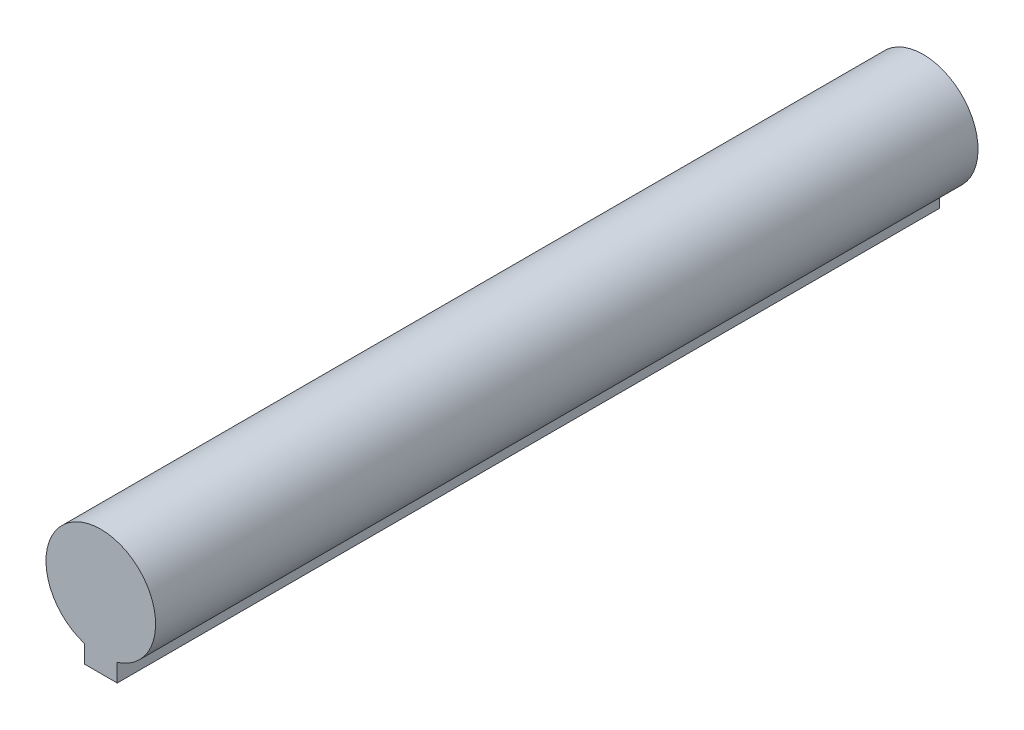
ISO-10303-21;
HEADER;
FILE_DESCRIPTION(('STEP AP214'),'2;1');
FILE_NAME('part.step','',(''),(''),'','','');
FILE_SCHEMA(('AUTOMOTIVE_DESIGN { 1 0 10303 214 1 1 1 1 }'));
ENDSEC;
DATA;
#1=APPLICATION_CONTEXT('core data for automotive mechanical design processes');
#2=APPLICATION_PROTOCOL_DEFINITION('international standard','automotive_design',2000,#1);
#3=PRODUCT_CONTEXT('',#1,'mechanical');
#4=PRODUCT('Part','Part','',(#3));
#5=PRODUCT_RELATED_PRODUCT_CATEGORY('part','',(#4));
#6=PRODUCT_DEFINITION_FORMATION('','',#4);
#7=PRODUCT_DEFINITION_CONTEXT('part definition',#1,'design');
#8=PRODUCT_DEFINITION('design','',#6,#7);
#9=PRODUCT_DEFINITION_SHAPE('','',#8);
#10=(LENGTH_UNIT() NAMED_UNIT(*) SI_UNIT(.MILLI.,.METRE.));
#11=(NAMED_UNIT(*) PLANE_ANGLE_UNIT() SI_UNIT($,.RADIAN.));
#12=(NAMED_UNIT(*) SI_UNIT($,.STERADIAN.) SOLID_ANGLE_UNIT());
#13=UNCERTAINTY_MEASURE_WITH_UNIT(LENGTH_MEASURE(1.E-05),#10,'distance_accuracy_value','');
#14=(GEOMETRIC_REPRESENTATION_CONTEXT(3) GLOBAL_UNCERTAINTY_ASSIGNED_CONTEXT((#13)) GLOBAL_UNIT_ASSIGNED_CONTEXT((#10,
#11,#12)) REPRESENTATION_CONTEXT('',''));
#15=CARTESIAN_POINT('',(0.,0.,0.));
#16=DIRECTION('',(0.,0.,1.));
#17=DIRECTION('',(1.,0.,0.));
#18=AXIS2_PLACEMENT_3D('',#15,#16,#17);
#19=CARTESIAN_POINT('',(-3.,-12.7993920141695,150.));
#20=DIRECTION('',(1.,0.,0.));
#21=DIRECTION('',(0.,0.,-1.));
#22=AXIS2_PLACEMENT_3D('',#19,#20,#21);
#23=PLANE('',#22);
#24=DIRECTION('',(0.,-1.,0.));
#25=VECTOR('',#24,1.);
#26=CARTESIAN_POINT('',(-3.,-12.7993920141695,0.));
#27=LINE('',#26,#25);
#28=CARTESIAN_POINT('',(-3.,-9.53939201416946,0.));
#29=VERTEX_POINT('',#28);
#30=CARTESIAN_POINT('',(-3.,-12.7993920141695,0.));
#31=VERTEX_POINT('',#30);
#32=EDGE_CURVE('E109',#29,#31,#27,.T.);
#33=ORIENTED_EDGE('',*,*,#32,.T.);
#34=DIRECTION('',(0.,0.,-1.));
#35=VECTOR('',#34,1.);
#36=CARTESIAN_POINT('',(-3.,-12.7993920141695,150.));
#37=LINE('',#36,#35);
#38=CARTESIAN_POINT('',(-3.,-12.7993920141695,150.));
#39=VERTEX_POINT('',#38);
#40=EDGE_CURVE('E11',#39,#31,#37,.T.);
#41=ORIENTED_EDGE('',*,*,#40,.F.);
#42=DIRECTION('',(0.,-1.,0.));
#43=VECTOR('',#42,1.);
#44=CARTESIAN_POINT('',(-3.,-12.7993920141695,150.));
#45=LINE('',#44,#43);
#46=CARTESIAN_POINT('',(-3.,-9.53939201416946,150.));
#47=VERTEX_POINT('',#46);
#48=EDGE_CURVE('E93',#47,#39,#45,.T.);
#49=ORIENTED_EDGE('',*,*,#48,.F.);
#50=DIRECTION('',(0.,0.,-1.));
#51=VECTOR('',#50,1.);
#52=CARTESIAN_POINT('',(-3.,-9.53939201416946,150.));
#53=LINE('',#52,#51);
#54=EDGE_CURVE('E105',#47,#29,#53,.T.);
#55=ORIENTED_EDGE('',*,*,#54,.T.);
#56=EDGE_LOOP('',(#33,#41,#49,#55));
#57=FACE_BOUND('',#56,.T.);
#58=ADVANCED_FACE('F41',(#57),#23,.F.);
#59=CARTESIAN_POINT('',(-3.,-12.7993920141695,150.));
#60=DIRECTION('',(0.,1.,0.));
#61=DIRECTION('',(0.,0.,1.));
#62=AXIS2_PLACEMENT_3D('',#59,#60,#61);
#63=PLANE('',#62);
#64=DIRECTION('',(1.,0.,0.));
#65=VECTOR('',#64,1.);
#66=CARTESIAN_POINT('',(-3.,-12.7993920141695,0.));
#67=LINE('',#66,#65);
#68=CARTESIAN_POINT('',(3.,-12.7993920141695,0.));
#69=VERTEX_POINT('',#68);
#70=EDGE_CURVE('E98',#31,#69,#67,.T.);
#71=ORIENTED_EDGE('',*,*,#70,.T.);
#72=DIRECTION('',(0.,0.,-1.));
#73=VECTOR('',#72,1.);
#74=CARTESIAN_POINT('',(3.,-12.7993920141695,150.));
#75=LINE('',#74,#73);
#76=CARTESIAN_POINT('',(3.,-12.7993920141695,150.));
#77=VERTEX_POINT('',#76);
#78=EDGE_CURVE('E50',#77,#69,#75,.T.);
#79=ORIENTED_EDGE('',*,*,#78,.F.);
#80=DIRECTION('',(1.,0.,0.));
#81=VECTOR('',#80,1.);
#82=CARTESIAN_POINT('',(-3.,-12.7993920141695,150.));
#83=LINE('',#82,#81);
#84=EDGE_CURVE('E88',#39,#77,#83,.T.);
#85=ORIENTED_EDGE('',*,*,#84,.F.);
#86=ORIENTED_EDGE('',*,*,#40,.T.);
#87=EDGE_LOOP('',(#71,#79,#85,#86));
#88=FACE_BOUND('',#87,.T.);
#89=ADVANCED_FACE('F97',(#88),#63,.F.);
#90=CARTESIAN_POINT('',(3.,-12.7993920141695,150.));
#91=DIRECTION('',(-1.,0.,0.));
#92=DIRECTION('',(0.,0.,1.));
#93=AXIS2_PLACEMENT_3D('',#90,#91,#92);
#94=PLANE('',#93);
#95=DIRECTION('',(0.,1.,0.));
#96=VECTOR('',#95,1.);
#97=CARTESIAN_POINT('',(3.,-12.7993920141695,0.));
#98=LINE('',#97,#96);
#99=CARTESIAN_POINT('',(3.,-9.53939201416946,0.));
#100=VERTEX_POINT('',#99);
#101=EDGE_CURVE('E75',#69,#100,#98,.T.);
#102=ORIENTED_EDGE('',*,*,#101,.T.);
#103=DIRECTION('',(0.,0.,-1.));
#104=VECTOR('',#103,1.);
#105=CARTESIAN_POINT('',(3.,-9.53939201416946,150.));
#106=LINE('',#105,#104);
#107=CARTESIAN_POINT('',(3.,-9.53939201416946,150.));
#108=VERTEX_POINT('',#107);
#109=EDGE_CURVE('E100',#108,#100,#106,.T.);
#110=ORIENTED_EDGE('',*,*,#109,.F.);
#111=DIRECTION('',(0.,1.,0.));
#112=VECTOR('',#111,1.);
#113=CARTESIAN_POINT('',(3.,-12.7993920141695,150.));
#114=LINE('',#113,#112);
#115=EDGE_CURVE('E91',#77,#108,#114,.T.);
#116=ORIENTED_EDGE('',*,*,#115,.F.);
#117=ORIENTED_EDGE('',*,*,#78,.T.);
#118=EDGE_LOOP('',(#102,#110,#116,#117));
#119=FACE_BOUND('',#118,.T.);
#120=ADVANCED_FACE('F101',(#119),#94,.F.);
#121=CARTESIAN_POINT('',(0.,0.,150.));
#122=DIRECTION('',(0.,0.,-1.));
#123=DIRECTION('',(-1.,0.,0.));
#124=AXIS2_PLACEMENT_3D('',#121,#122,#123);
#125=CYLINDRICAL_SURFACE('',#124,10.);
#126=CARTESIAN_POINT('',(0.,0.,0.));
#127=DIRECTION('',(0.,0.,1.));
#128=DIRECTION('',(1.,0.,0.));
#129=AXIS2_PLACEMENT_3D('',#126,#127,#128);
#130=CIRCLE('',#129,10.);
#131=EDGE_CURVE('E81',#100,#29,#130,.T.);
#132=ORIENTED_EDGE('',*,*,#131,.T.);
#133=ORIENTED_EDGE('',*,*,#54,.F.);
#134=CARTESIAN_POINT('',(0.,0.,150.));
#135=DIRECTION('',(0.,0.,1.));
#136=DIRECTION('',(1.,0.,0.));
#137=AXIS2_PLACEMENT_3D('',#134,#135,#136);
#138=CIRCLE('',#137,10.);
#139=EDGE_CURVE('E58',#108,#47,#138,.T.);
#140=ORIENTED_EDGE('',*,*,#139,.F.);
#141=ORIENTED_EDGE('',*,*,#109,.T.);
#142=EDGE_LOOP('',(#132,#133,#140,#141));
#143=FACE_BOUND('',#142,.T.);
#144=ADVANCED_FACE('F122',(#143),#125,.T.);
#145=CARTESIAN_POINT('',(0.,0.,150.));
#146=DIRECTION('',(0.,0.,1.));
#147=DIRECTION('',(1.,0.,0.));
#148=AXIS2_PLACEMENT_3D('',#145,#146,#147);
#149=PLANE('',#148);
#150=ORIENTED_EDGE('',*,*,#48,.T.);
#151=ORIENTED_EDGE('',*,*,#84,.T.);
#152=ORIENTED_EDGE('',*,*,#115,.T.);
#153=ORIENTED_EDGE('',*,*,#139,.T.);
#154=EDGE_LOOP('',(#150,#151,#152,#153));
#155=FACE_BOUND('',#154,.T.);
#156=ADVANCED_FACE('F89',(#155),#149,.T.);
#157=CARTESIAN_POINT('',(0.,0.,0.));
#158=DIRECTION('',(0.,0.,1.));
#159=DIRECTION('',(1.,0.,0.));
#160=AXIS2_PLACEMENT_3D('',#157,#158,#159);
#161=PLANE('',#160);
#162=ORIENTED_EDGE('',*,*,#32,.F.);
#163=ORIENTED_EDGE('',*,*,#131,.F.);
#164=ORIENTED_EDGE('',*,*,#101,.F.);
#165=ORIENTED_EDGE('',*,*,#70,.F.);
#166=EDGE_LOOP('',(#162,#163,#164,#165));
#167=FACE_BOUND('',#166,.T.);
#168=ADVANCED_FACE('F125',(#167),#161,.F.);
#169=CLOSED_SHELL('',(#58,#89,#120,#144,#156,#168));
#170=MANIFOLD_SOLID_BREP('B2',#169);
#171=ADVANCED_BREP_SHAPE_REPRESENTATION('',(#18,#170),#14);
#172=SHAPE_DEFINITION_REPRESENTATION(#9,#171);
ENDSEC;
END-ISO-10303-21;
